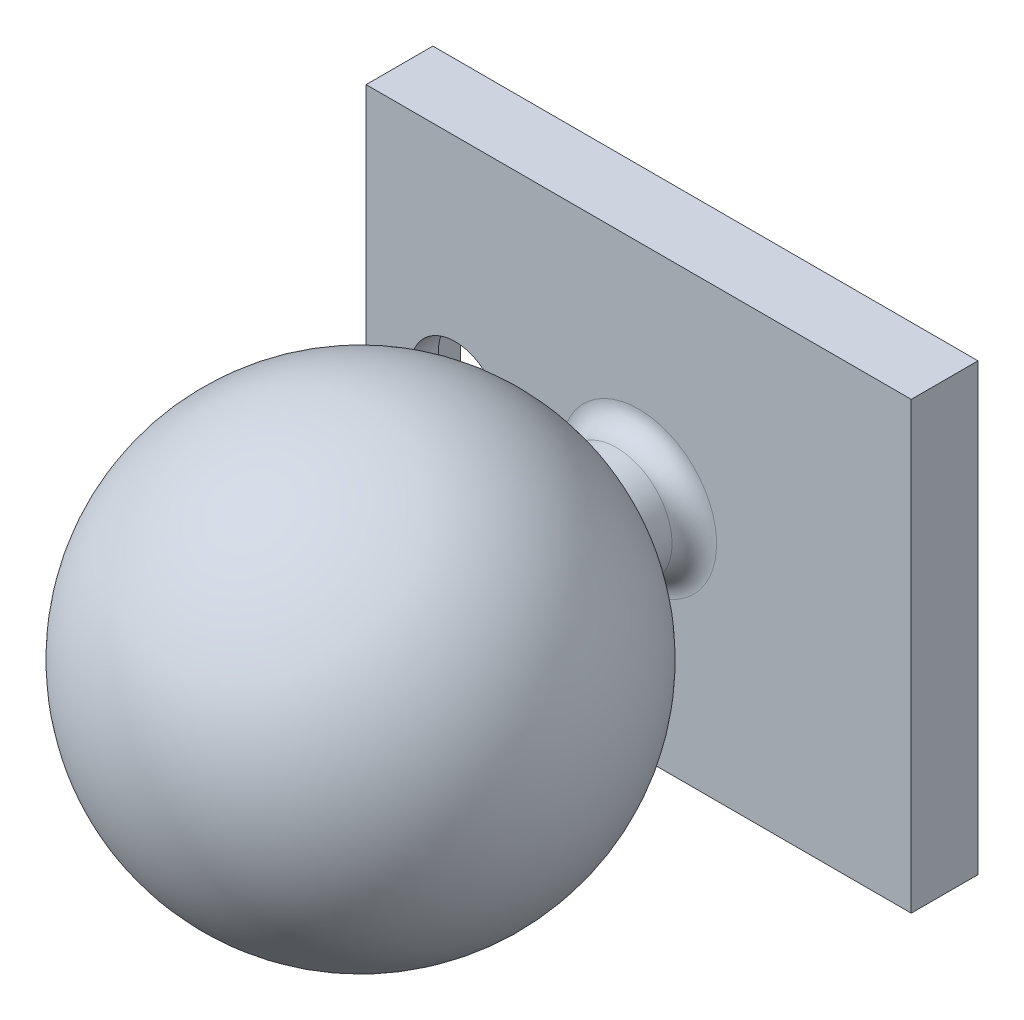
ISO-10303-21;
HEADER;
FILE_DESCRIPTION(('STEP AP214'),'2;1');
FILE_NAME('part.step','',(''),(''),'','','');
FILE_SCHEMA(('AUTOMOTIVE_DESIGN { 1 0 10303 214 1 1 1 1 }'));
ENDSEC;
DATA;
#1=APPLICATION_CONTEXT('core data for automotive mechanical design processes');
#2=APPLICATION_PROTOCOL_DEFINITION('international standard','automotive_design',2000,#1);
#3=PRODUCT_CONTEXT('',#1,'mechanical');
#4=PRODUCT('Part','Part','',(#3));
#5=PRODUCT_RELATED_PRODUCT_CATEGORY('part','',(#4));
#6=PRODUCT_DEFINITION_FORMATION('','',#4);
#7=PRODUCT_DEFINITION_CONTEXT('part definition',#1,'design');
#8=PRODUCT_DEFINITION('design','',#6,#7);
#9=PRODUCT_DEFINITION_SHAPE('','',#8);
#10=(LENGTH_UNIT() NAMED_UNIT(*) SI_UNIT(.MILLI.,.METRE.));
#11=(NAMED_UNIT(*) PLANE_ANGLE_UNIT() SI_UNIT($,.RADIAN.));
#12=(NAMED_UNIT(*) SI_UNIT($,.STERADIAN.) SOLID_ANGLE_UNIT());
#13=UNCERTAINTY_MEASURE_WITH_UNIT(LENGTH_MEASURE(1.E-05),#10,'distance_accuracy_value','');
#14=(GEOMETRIC_REPRESENTATION_CONTEXT(3) GLOBAL_UNCERTAINTY_ASSIGNED_CONTEXT((#13)) GLOBAL_UNIT_ASSIGNED_CONTEXT((#10,
#11,#12)) REPRESENTATION_CONTEXT('',''));
#15=CARTESIAN_POINT('',(0.,0.,0.));
#16=DIRECTION('',(0.,0.,1.));
#17=DIRECTION('',(1.,0.,0.));
#18=AXIS2_PLACEMENT_3D('',#15,#16,#17);
#19=CARTESIAN_POINT('',(0.,0.,3.175));
#20=DIRECTION('',(0.,0.,-1.));
#21=DIRECTION('',(-1.,0.,0.));
#22=AXIS2_PLACEMENT_3D('',#19,#20,#21);
#23=PLANE('',#22);
#24=CARTESIAN_POINT('',(-20.955,0.,3.175));
#25=DIRECTION('',(0.,0.,1.));
#26=DIRECTION('',(1.,0.,0.));
#27=AXIS2_PLACEMENT_3D('',#24,#25,#26);
#28=CIRCLE('',#27,5.08);
#29=CARTESIAN_POINT('',(-15.875,0.,3.175));
#30=VERTEX_POINT('',#29);
#31=EDGE_CURVE('E130',#30,#30,#28,.T.);
#32=ORIENTED_EDGE('',*,*,#31,.F.);
#33=EDGE_LOOP('',(#32));
#34=FACE_BOUND('',#33,.T.);
#35=CARTESIAN_POINT('',(0.,0.,3.175));
#36=DIRECTION('',(0.,0.,-1.));
#37=DIRECTION('',(-1.,0.,0.));
#38=AXIS2_PLACEMENT_3D('',#35,#36,#37);
#39=CIRCLE('',#38,8.89);
#40=CARTESIAN_POINT('',(-8.89,0.,3.175));
#41=VERTEX_POINT('',#40);
#42=EDGE_CURVE('E11',#41,#41,#39,.T.);
#43=ORIENTED_EDGE('',*,*,#42,.T.);
#44=EDGE_LOOP('',(#43));
#45=FACE_BOUND('',#44,.T.);
#46=DIRECTION('',(1.,0.,0.));
#47=VECTOR('',#46,1.);
#48=CARTESIAN_POINT('',(-31.115,-25.4,3.175));
#49=LINE('',#48,#47);
#50=CARTESIAN_POINT('',(-31.115,-25.4,3.175));
#51=VERTEX_POINT('',#50);
#52=CARTESIAN_POINT('',(31.115,-25.4,3.175));
#53=VERTEX_POINT('',#52);
#54=EDGE_CURVE('E137',#51,#53,#49,.T.);
#55=ORIENTED_EDGE('',*,*,#54,.T.);
#56=DIRECTION('',(0.,1.,0.));
#57=VECTOR('',#56,1.);
#58=CARTESIAN_POINT('',(31.115,-25.4,3.175));
#59=LINE('',#58,#57);
#60=CARTESIAN_POINT('',(31.115,25.4,3.175));
#61=VERTEX_POINT('',#60);
#62=EDGE_CURVE('E158',#53,#61,#59,.T.);
#63=ORIENTED_EDGE('',*,*,#62,.T.);
#64=DIRECTION('',(-1.,0.,0.));
#65=VECTOR('',#64,1.);
#66=CARTESIAN_POINT('',(31.115,25.4,3.175));
#67=LINE('',#66,#65);
#68=CARTESIAN_POINT('',(-31.115,25.4,3.175));
#69=VERTEX_POINT('',#68);
#70=EDGE_CURVE('E161',#61,#69,#67,.T.);
#71=ORIENTED_EDGE('',*,*,#70,.T.);
#72=DIRECTION('',(0.,-1.,0.));
#73=VECTOR('',#72,1.);
#74=CARTESIAN_POINT('',(-31.115,25.4,3.175));
#75=LINE('',#74,#73);
#76=EDGE_CURVE('E146',#69,#51,#75,.T.);
#77=ORIENTED_EDGE('',*,*,#76,.T.);
#78=EDGE_LOOP('',(#55,#63,#71,#77));
#79=FACE_BOUND('',#78,.T.);
#80=ADVANCED_FACE('F41',(#34,#45,#79),#23,.F.);
#81=CARTESIAN_POINT('',(-31.115,-25.4,-4.445));
#82=DIRECTION('',(0.,-1.,0.));
#83=DIRECTION('',(0.,0.,-1.));
#84=AXIS2_PLACEMENT_3D('',#81,#82,#83);
#85=PLANE('',#84);
#86=ORIENTED_EDGE('',*,*,#54,.F.);
#87=DIRECTION('',(0.,0.,1.));
#88=VECTOR('',#87,1.);
#89=CARTESIAN_POINT('',(-31.115,-25.4,-4.445));
#90=LINE('',#89,#88);
#91=CARTESIAN_POINT('',(-31.115,-25.4,-4.445));
#92=VERTEX_POINT('',#91);
#93=EDGE_CURVE('E166',#92,#51,#90,.T.);
#94=ORIENTED_EDGE('',*,*,#93,.F.);
#95=DIRECTION('',(1.,0.,0.));
#96=VECTOR('',#95,1.);
#97=CARTESIAN_POINT('',(-31.115,-25.4,-4.445));
#98=LINE('',#97,#96);
#99=CARTESIAN_POINT('',(31.115,-25.4,-4.445));
#100=VERTEX_POINT('',#99);
#101=EDGE_CURVE('E142',#92,#100,#98,.T.);
#102=ORIENTED_EDGE('',*,*,#101,.T.);
#103=DIRECTION('',(0.,0.,1.));
#104=VECTOR('',#103,1.);
#105=CARTESIAN_POINT('',(31.115,-25.4,-4.445));
#106=LINE('',#105,#104);
#107=EDGE_CURVE('E155',#100,#53,#106,.T.);
#108=ORIENTED_EDGE('',*,*,#107,.T.);
#109=EDGE_LOOP('',(#86,#94,#102,#108));
#110=FACE_BOUND('',#109,.T.);
#111=ADVANCED_FACE('F210',(#110),#85,.T.);
#112=CARTESIAN_POINT('',(-31.115,25.4,-4.445));
#113=DIRECTION('',(-1.,0.,0.));
#114=DIRECTION('',(0.,0.,1.));
#115=AXIS2_PLACEMENT_3D('',#112,#113,#114);
#116=PLANE('',#115);
#117=ORIENTED_EDGE('',*,*,#76,.F.);
#118=DIRECTION('',(0.,0.,1.));
#119=VECTOR('',#118,1.);
#120=CARTESIAN_POINT('',(-31.115,25.4,-4.445));
#121=LINE('',#120,#119);
#122=CARTESIAN_POINT('',(-31.115,25.4,-4.445));
#123=VERTEX_POINT('',#122);
#124=EDGE_CURVE('E168',#123,#69,#121,.T.);
#125=ORIENTED_EDGE('',*,*,#124,.F.);
#126=DIRECTION('',(0.,-1.,0.));
#127=VECTOR('',#126,1.);
#128=CARTESIAN_POINT('',(-31.115,25.4,-4.445));
#129=LINE('',#128,#127);
#130=EDGE_CURVE('E152',#123,#92,#129,.T.);
#131=ORIENTED_EDGE('',*,*,#130,.T.);
#132=ORIENTED_EDGE('',*,*,#93,.T.);
#133=EDGE_LOOP('',(#117,#125,#131,#132));
#134=FACE_BOUND('',#133,.T.);
#135=ADVANCED_FACE('F226',(#134),#116,.T.);
#136=CARTESIAN_POINT('',(31.115,25.4,-4.445));
#137=DIRECTION('',(0.,1.,0.));
#138=DIRECTION('',(0.,0.,1.));
#139=AXIS2_PLACEMENT_3D('',#136,#137,#138);
#140=PLANE('',#139);
#141=ORIENTED_EDGE('',*,*,#70,.F.);
#142=DIRECTION('',(0.,0.,1.));
#143=VECTOR('',#142,1.);
#144=CARTESIAN_POINT('',(31.115,25.4,-4.445));
#145=LINE('',#144,#143);
#146=CARTESIAN_POINT('',(31.115,25.4,-4.445));
#147=VERTEX_POINT('',#146);
#148=EDGE_CURVE('E170',#147,#61,#145,.T.);
#149=ORIENTED_EDGE('',*,*,#148,.F.);
#150=DIRECTION('',(-1.,0.,0.));
#151=VECTOR('',#150,1.);
#152=CARTESIAN_POINT('',(31.115,25.4,-4.445));
#153=LINE('',#152,#151);
#154=EDGE_CURVE('E149',#147,#123,#153,.T.);
#155=ORIENTED_EDGE('',*,*,#154,.T.);
#156=ORIENTED_EDGE('',*,*,#124,.T.);
#157=EDGE_LOOP('',(#141,#149,#155,#156));
#158=FACE_BOUND('',#157,.T.);
#159=ADVANCED_FACE('F224',(#158),#140,.T.);
#160=CARTESIAN_POINT('',(31.115,-25.4,-4.445));
#161=DIRECTION('',(1.,0.,0.));
#162=DIRECTION('',(0.,0.,-1.));
#163=AXIS2_PLACEMENT_3D('',#160,#161,#162);
#164=PLANE('',#163);
#165=ORIENTED_EDGE('',*,*,#62,.F.);
#166=ORIENTED_EDGE('',*,*,#107,.F.);
#167=DIRECTION('',(0.,1.,0.));
#168=VECTOR('',#167,1.);
#169=CARTESIAN_POINT('',(31.115,-25.4,-4.445));
#170=LINE('',#169,#168);
#171=EDGE_CURVE('E145',#100,#147,#170,.T.);
#172=ORIENTED_EDGE('',*,*,#171,.T.);
#173=ORIENTED_EDGE('',*,*,#148,.T.);
#174=EDGE_LOOP('',(#165,#166,#172,#173));
#175=FACE_BOUND('',#174,.T.);
#176=ADVANCED_FACE('F220',(#175),#164,.T.);
#177=CARTESIAN_POINT('',(0.,0.,-4.445));
#178=DIRECTION('',(0.,0.,1.));
#179=DIRECTION('',(1.,0.,0.));
#180=AXIS2_PLACEMENT_3D('',#177,#178,#179);
#181=PLANE('',#180);
#182=DIRECTION('',(0.,-1.,0.));
#183=VECTOR('',#182,1.);
#184=CARTESIAN_POINT('',(-27.94,22.225,-4.445));
#185=LINE('',#184,#183);
#186=CARTESIAN_POINT('',(-27.94,22.225,-4.445));
#187=VERTEX_POINT('',#186);
#188=CARTESIAN_POINT('',(-27.94,-22.225,-4.445));
#189=VERTEX_POINT('',#188);
#190=EDGE_CURVE('E114',#187,#189,#185,.T.);
#191=ORIENTED_EDGE('',*,*,#190,.T.);
#192=DIRECTION('',(1.,0.,0.));
#193=VECTOR('',#192,1.);
#194=CARTESIAN_POINT('',(-27.94,-22.225,-4.445));
#195=LINE('',#194,#193);
#196=CARTESIAN_POINT('',(27.94,-22.225,-4.445));
#197=VERTEX_POINT('',#196);
#198=EDGE_CURVE('E110',#189,#197,#195,.T.);
#199=ORIENTED_EDGE('',*,*,#198,.T.);
#200=DIRECTION('',(0.,1.,0.));
#201=VECTOR('',#200,1.);
#202=CARTESIAN_POINT('',(27.94,-22.225,-4.445));
#203=LINE('',#202,#201);
#204=CARTESIAN_POINT('',(27.94,22.225,-4.445));
#205=VERTEX_POINT('',#204);
#206=EDGE_CURVE('E118',#197,#205,#203,.T.);
#207=ORIENTED_EDGE('',*,*,#206,.T.);
#208=DIRECTION('',(-1.,0.,0.));
#209=VECTOR('',#208,1.);
#210=CARTESIAN_POINT('',(27.94,22.225,-4.445));
#211=LINE('',#210,#209);
#212=EDGE_CURVE('E123',#205,#187,#211,.T.);
#213=ORIENTED_EDGE('',*,*,#212,.T.);
#214=EDGE_LOOP('',(#191,#199,#207,#213));
#215=FACE_BOUND('',#214,.T.);
#216=ORIENTED_EDGE('',*,*,#101,.F.);
#217=ORIENTED_EDGE('',*,*,#130,.F.);
#218=ORIENTED_EDGE('',*,*,#154,.F.);
#219=ORIENTED_EDGE('',*,*,#171,.F.);
#220=EDGE_LOOP('',(#216,#217,#218,#219));
#221=FACE_BOUND('',#220,.T.);
#222=ADVANCED_FACE('F125',(#215,#221),#181,.F.);
#223=CARTESIAN_POINT('',(-27.94,-22.225,-4.445));
#224=DIRECTION('',(0.,-1.,0.));
#225=DIRECTION('',(0.,0.,-1.));
#226=AXIS2_PLACEMENT_3D('',#223,#224,#225);
#227=PLANE('',#226);
#228=DIRECTION('',(1.,0.,0.));
#229=VECTOR('',#228,1.);
#230=CARTESIAN_POINT('',(-27.94,-22.225,0.));
#231=LINE('',#230,#229);
#232=CARTESIAN_POINT('',(-27.94,-22.225,0.));
#233=VERTEX_POINT('',#232);
#234=CARTESIAN_POINT('',(27.94,-22.225,0.));
#235=VERTEX_POINT('',#234);
#236=EDGE_CURVE('E61',#233,#235,#231,.T.);
#237=ORIENTED_EDGE('',*,*,#236,.T.);
#238=DIRECTION('',(0.,0.,1.));
#239=VECTOR('',#238,1.);
#240=CARTESIAN_POINT('',(27.94,-22.225,-4.445));
#241=LINE('',#240,#239);
#242=EDGE_CURVE('E105',#197,#235,#241,.T.);
#243=ORIENTED_EDGE('',*,*,#242,.F.);
#244=ORIENTED_EDGE('',*,*,#198,.F.);
#245=DIRECTION('',(0.,0.,1.));
#246=VECTOR('',#245,1.);
#247=CARTESIAN_POINT('',(-27.94,-22.225,-4.445));
#248=LINE('',#247,#246);
#249=EDGE_CURVE('E135',#189,#233,#248,.T.);
#250=ORIENTED_EDGE('',*,*,#249,.T.);
#251=EDGE_LOOP('',(#237,#243,#244,#250));
#252=FACE_BOUND('',#251,.T.);
#253=ADVANCED_FACE('F107',(#252),#227,.F.);
#254=CARTESIAN_POINT('',(-27.94,22.225,-4.445));
#255=DIRECTION('',(-1.,0.,0.));
#256=DIRECTION('',(0.,0.,1.));
#257=AXIS2_PLACEMENT_3D('',#254,#255,#256);
#258=PLANE('',#257);
#259=DIRECTION('',(0.,-1.,0.));
#260=VECTOR('',#259,1.);
#261=CARTESIAN_POINT('',(-27.94,-22.225,0.));
#262=LINE('',#261,#260);
#263=CARTESIAN_POINT('',(-27.94,22.225,0.));
#264=VERTEX_POINT('',#263);
#265=EDGE_CURVE('E177',#264,#233,#262,.T.);
#266=ORIENTED_EDGE('',*,*,#265,.T.);
#267=ORIENTED_EDGE('',*,*,#249,.F.);
#268=ORIENTED_EDGE('',*,*,#190,.F.);
#269=DIRECTION('',(0.,0.,1.));
#270=VECTOR('',#269,1.);
#271=CARTESIAN_POINT('',(-27.94,22.225,-4.445));
#272=LINE('',#271,#270);
#273=EDGE_CURVE('E138',#187,#264,#272,.T.);
#274=ORIENTED_EDGE('',*,*,#273,.T.);
#275=EDGE_LOOP('',(#266,#267,#268,#274));
#276=FACE_BOUND('',#275,.T.);
#277=ADVANCED_FACE('F234',(#276),#258,.F.);
#278=CARTESIAN_POINT('',(27.94,22.225,-4.445));
#279=DIRECTION('',(0.,1.,0.));
#280=DIRECTION('',(0.,0.,1.));
#281=AXIS2_PLACEMENT_3D('',#278,#279,#280);
#282=PLANE('',#281);
#283=DIRECTION('',(-1.,0.,0.));
#284=VECTOR('',#283,1.);
#285=CARTESIAN_POINT('',(-27.94,22.225,0.));
#286=LINE('',#285,#284);
#287=CARTESIAN_POINT('',(27.94,22.225,0.));
#288=VERTEX_POINT('',#287);
#289=EDGE_CURVE('E174',#288,#264,#286,.T.);
#290=ORIENTED_EDGE('',*,*,#289,.T.);
#291=ORIENTED_EDGE('',*,*,#273,.F.);
#292=ORIENTED_EDGE('',*,*,#212,.F.);
#293=DIRECTION('',(0.,0.,1.));
#294=VECTOR('',#293,1.);
#295=CARTESIAN_POINT('',(27.94,22.225,-4.445));
#296=LINE('',#295,#294);
#297=EDGE_CURVE('E113',#205,#288,#296,.T.);
#298=ORIENTED_EDGE('',*,*,#297,.T.);
#299=EDGE_LOOP('',(#290,#291,#292,#298));
#300=FACE_BOUND('',#299,.T.);
#301=ADVANCED_FACE('F250',(#300),#282,.F.);
#302=CARTESIAN_POINT('',(27.94,-22.225,-4.445));
#303=DIRECTION('',(1.,0.,0.));
#304=DIRECTION('',(0.,0.,-1.));
#305=AXIS2_PLACEMENT_3D('',#302,#303,#304);
#306=PLANE('',#305);
#307=DIRECTION('',(0.,1.,0.));
#308=VECTOR('',#307,1.);
#309=CARTESIAN_POINT('',(27.94,-22.225,0.));
#310=LINE('',#309,#308);
#311=EDGE_CURVE('E57',#235,#288,#310,.T.);
#312=ORIENTED_EDGE('',*,*,#311,.T.);
#313=ORIENTED_EDGE('',*,*,#297,.F.);
#314=ORIENTED_EDGE('',*,*,#206,.F.);
#315=ORIENTED_EDGE('',*,*,#242,.T.);
#316=EDGE_LOOP('',(#312,#313,#314,#315));
#317=FACE_BOUND('',#316,.T.);
#318=ADVANCED_FACE('F119',(#317),#306,.F.);
#319=CARTESIAN_POINT('',(0.,0.,0.));
#320=DIRECTION('',(0.,0.,-1.));
#321=DIRECTION('',(-1.,0.,0.));
#322=AXIS2_PLACEMENT_3D('',#319,#320,#321);
#323=PLANE('',#322);
#324=CARTESIAN_POINT('',(-20.955,0.,0.));
#325=DIRECTION('',(0.,0.,-1.));
#326=DIRECTION('',(-1.,0.,0.));
#327=AXIS2_PLACEMENT_3D('',#324,#325,#326);
#328=CIRCLE('',#327,5.08);
#329=CARTESIAN_POINT('',(-26.035,0.,0.));
#330=VERTEX_POINT('',#329);
#331=EDGE_CURVE('E45',#330,#330,#328,.T.);
#332=ORIENTED_EDGE('',*,*,#331,.F.);
#333=EDGE_LOOP('',(#332));
#334=FACE_BOUND('',#333,.T.);
#335=ORIENTED_EDGE('',*,*,#311,.F.);
#336=ORIENTED_EDGE('',*,*,#236,.F.);
#337=ORIENTED_EDGE('',*,*,#265,.F.);
#338=ORIENTED_EDGE('',*,*,#289,.F.);
#339=EDGE_LOOP('',(#335,#336,#337,#338));
#340=FACE_BOUND('',#339,.T.);
#341=ADVANCED_FACE('F199',(#334,#340),#323,.T.);
#342=CARTESIAN_POINT('',(0.,0.,1.17189016629586E-12));
#343=DIRECTION('',(0.,0.,-1.));
#344=DIRECTION('',(-1.,0.,0.));
#345=AXIS2_PLACEMENT_3D('',#342,#343,#344);
#346=CYLINDRICAL_SURFACE('',#345,6.35);
#347=CARTESIAN_POINT('',(0.,0.,8.43704990943995));
#348=DIRECTION('',(0.,0.,1.));
#349=DIRECTION('',(1.,0.,0.));
#350=AXIS2_PLACEMENT_3D('',#347,#348,#349);
#351=CIRCLE('',#350,6.35);
#352=CARTESIAN_POINT('',(6.35,0.,8.43704990943995));
#353=VERTEX_POINT('',#352);
#354=EDGE_CURVE('E183',#353,#353,#351,.F.);
#355=ORIENTED_EDGE('',*,*,#354,.T.);
#356=EDGE_LOOP('',(#355));
#357=FACE_BOUND('',#356,.T.);
#358=CARTESIAN_POINT('',(0.,0.,5.715));
#359=DIRECTION('',(0.,0.,-1.));
#360=DIRECTION('',(-1.,0.,0.));
#361=AXIS2_PLACEMENT_3D('',#358,#359,#360);
#362=CIRCLE('',#361,6.35);
#363=CARTESIAN_POINT('',(-6.35,0.,5.715));
#364=VERTEX_POINT('',#363);
#365=EDGE_CURVE('E180',#364,#364,#362,.F.);
#366=ORIENTED_EDGE('',*,*,#365,.T.);
#367=EDGE_LOOP('',(#366));
#368=FACE_BOUND('',#367,.T.);
#369=ADVANCED_FACE('F196',(#357,#368),#346,.T.);
#370=CARTESIAN_POINT('',(0.,0.,34.925));
#371=DIRECTION('',(0.,0.,-1.));
#372=DIRECTION('',(1.,0.,0.));
#373=AXIS2_PLACEMENT_3D('',#370,#371,#372);
#374=SPHERICAL_SURFACE('',#373,25.4);
#375=CARTESIAN_POINT('',(0.,0.,10.8450453722181));
#376=DIRECTION('',(0.,0.,1.));
#377=DIRECTION('',(1.,0.,0.));
#378=AXIS2_PLACEMENT_3D('',#375,#376,#377);
#379=CIRCLE('',#378,8.08181818181818);
#380=CARTESIAN_POINT('',(8.08181818181818,0.,10.8450453722181));
#381=VERTEX_POINT('',#380);
#382=EDGE_CURVE('E50',#381,#381,#379,.T.);
#383=ORIENTED_EDGE('',*,*,#382,.T.);
#384=EDGE_LOOP('',(#383));
#385=FACE_BOUND('',#384,.T.);
#386=ADVANCED_FACE('F189',(#385),#374,.T.);
#387=CARTESIAN_POINT('',(0.,0.,8.43704990943995));
#388=DIRECTION('',(0.,0.,1.));
#389=DIRECTION('',(1.,0.,0.));
#390=AXIS2_PLACEMENT_3D('',#387,#388,#389);
#391=TOROIDAL_SURFACE('',#390,8.89,2.54);
#392=ORIENTED_EDGE('',*,*,#382,.F.);
#393=EDGE_LOOP('',(#392));
#394=FACE_BOUND('',#393,.T.);
#395=ORIENTED_EDGE('',*,*,#354,.F.);
#396=EDGE_LOOP('',(#395));
#397=FACE_BOUND('',#396,.T.);
#398=ADVANCED_FACE('F191',(#394,#397),#391,.F.);
#399=CARTESIAN_POINT('',(0.,0.,5.715));
#400=DIRECTION('',(0.,0.,-1.));
#401=DIRECTION('',(-1.,0.,0.));
#402=AXIS2_PLACEMENT_3D('',#399,#400,#401);
#403=TOROIDAL_SURFACE('',#402,8.89,2.54);
#404=ORIENTED_EDGE('',*,*,#365,.F.);
#405=EDGE_LOOP('',(#404));
#406=FACE_BOUND('',#405,.T.);
#407=ORIENTED_EDGE('',*,*,#42,.F.);
#408=EDGE_LOOP('',(#407));
#409=FACE_BOUND('',#408,.T.);
#410=ADVANCED_FACE('F43',(#406,#409),#403,.F.);
#411=CARTESIAN_POINT('',(-20.955,0.,-12.7));
#412=DIRECTION('',(0.,0.,1.));
#413=DIRECTION('',(1.,0.,0.));
#414=AXIS2_PLACEMENT_3D('',#411,#412,#413);
#415=CYLINDRICAL_SURFACE('',#414,5.08);
#416=ORIENTED_EDGE('',*,*,#331,.T.);
#417=EDGE_LOOP('',(#416));
#418=FACE_BOUND('',#417,.T.);
#419=ORIENTED_EDGE('',*,*,#31,.T.);
#420=EDGE_LOOP('',(#419));
#421=FACE_BOUND('',#420,.T.);
#422=ADVANCED_FACE('F205',(#418,#421),#415,.F.);
#423=CLOSED_SHELL('',(#80,#111,#135,#159,#176,#222,#253,#277,#301,#318,#341,#369,#386,#398,#410,#422));
#424=MANIFOLD_SOLID_BREP('B2',#423);
#425=ADVANCED_BREP_SHAPE_REPRESENTATION('',(#18,#424),#14);
#426=SHAPE_DEFINITION_REPRESENTATION(#9,#425);
ENDSEC;
END-ISO-10303-21;
